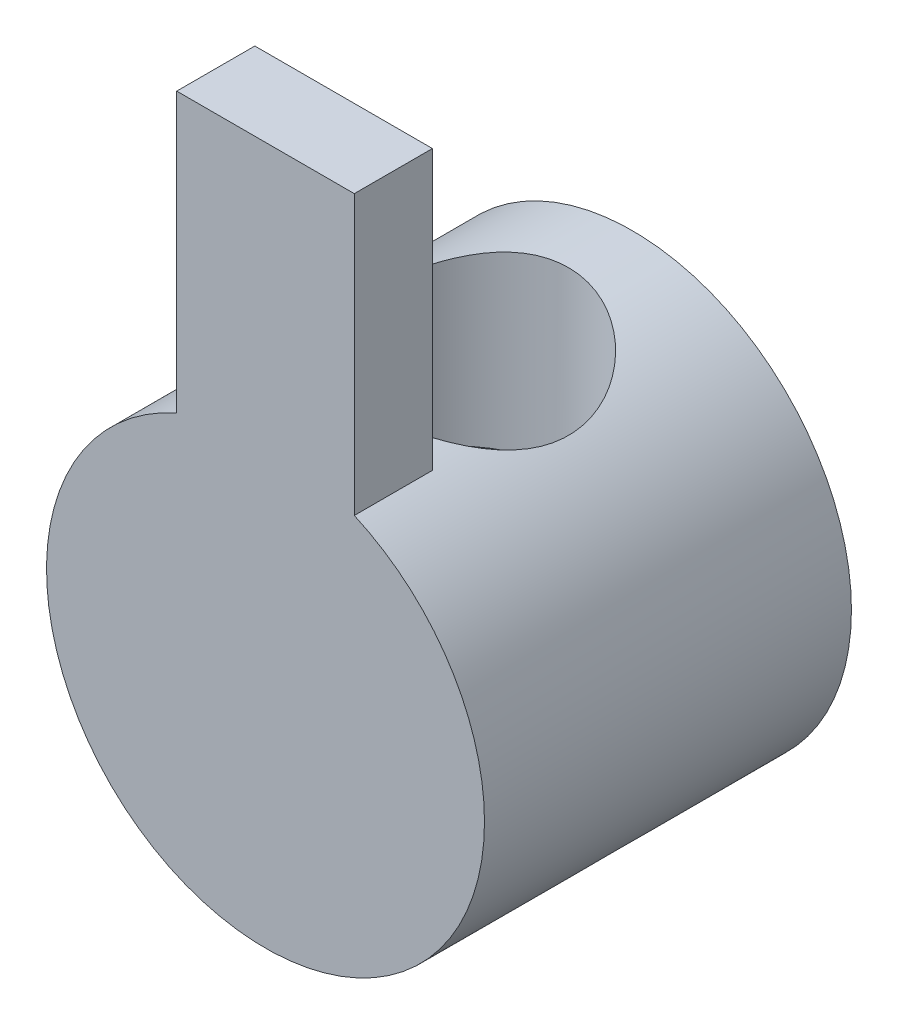
ISO-10303-21;
HEADER;
FILE_DESCRIPTION(('STEP AP214'),'2;1');
FILE_NAME('part.step','',(''),(''),'','','');
FILE_SCHEMA(('AUTOMOTIVE_DESIGN { 1 0 10303 214 1 1 1 1 }'));
ENDSEC;
DATA;
#1=APPLICATION_CONTEXT('core data for automotive mechanical design processes');
#2=APPLICATION_PROTOCOL_DEFINITION('international standard','automotive_design',2000,#1);
#3=PRODUCT_CONTEXT('',#1,'mechanical');
#4=PRODUCT('Part','Part','',(#3));
#5=PRODUCT_RELATED_PRODUCT_CATEGORY('part','',(#4));
#6=PRODUCT_DEFINITION_FORMATION('','',#4);
#7=PRODUCT_DEFINITION_CONTEXT('part definition',#1,'design');
#8=PRODUCT_DEFINITION('design','',#6,#7);
#9=PRODUCT_DEFINITION_SHAPE('','',#8);
#10=(LENGTH_UNIT() NAMED_UNIT(*) SI_UNIT(.MILLI.,.METRE.));
#11=(NAMED_UNIT(*) PLANE_ANGLE_UNIT() SI_UNIT($,.RADIAN.));
#12=(NAMED_UNIT(*) SI_UNIT($,.STERADIAN.) SOLID_ANGLE_UNIT());
#13=UNCERTAINTY_MEASURE_WITH_UNIT(LENGTH_MEASURE(1.E-05),#10,'distance_accuracy_value','');
#14=(GEOMETRIC_REPRESENTATION_CONTEXT(3) GLOBAL_UNCERTAINTY_ASSIGNED_CONTEXT((#13)) GLOBAL_UNIT_ASSIGNED_CONTEXT((#10,
#11,#12)) REPRESENTATION_CONTEXT('',''));
#15=CARTESIAN_POINT('',(0.,0.,0.));
#16=DIRECTION('',(0.,0.,1.));
#17=DIRECTION('',(1.,0.,0.));
#18=AXIS2_PLACEMENT_3D('',#15,#16,#17);
#19=CARTESIAN_POINT('',(0.,-4.98,-12.2));
#20=DIRECTION('',(0.,0.,1.));
#21=DIRECTION('',(1.,0.,0.));
#22=AXIS2_PLACEMENT_3D('',#19,#20,#21);
#23=CYLINDRICAL_SURFACE('',#22,9.25);
#24=CARTESIAN_POINT('',(0.,-4.98,-12.2));
#25=DIRECTION('',(0.,0.,1.));
#26=DIRECTION('',(1.,0.,0.));
#27=AXIS2_PLACEMENT_3D('',#24,#25,#26);
#28=CIRCLE('',#27,9.25);
#29=CARTESIAN_POINT('',(9.25,-4.98,-12.2));
#30=VERTEX_POINT('',#29);
#31=EDGE_CURVE('E110',#30,#30,#28,.T.);
#32=ORIENTED_EDGE('',*,*,#31,.T.);
#33=EDGE_LOOP('',(#32));
#34=FACE_BOUND('',#33,.T.);
#35=CARTESIAN_POINT('',(0.,4.27,0.0999999999999985));
#36=CARTESIAN_POINT('',(0.125647593510289,4.27000003453545,0.10000006483692));
#37=CARTESIAN_POINT('',(0.251295223069269,4.26743424987173,0.0950611530799217));
#38=CARTESIAN_POINT('',(0.501657560367798,4.25723675366162,0.0753652798764421));
#39=CARTESIAN_POINT('',(0.626371891110943,4.24960309606137,0.0606045468637359));
#40=CARTESIAN_POINT('',(0.874030423508736,4.22945308804311,0.0214201803725621));
#41=CARTESIAN_POINT('',(0.996972205637634,4.21693061816722,-0.00301556412363308));
#42=CARTESIAN_POINT('',(1.24009527169886,4.18731532626962,-0.0612718703106895));
#43=CARTESIAN_POINT('',(1.36027540560374,4.17022063640265,-0.0950962676718929));
#44=CARTESIAN_POINT('',(1.59651612061386,4.13196390423794,-0.171591944839765));
#45=CARTESIAN_POINT('',(1.71259262297169,4.11082025745936,-0.21422327882276));
#46=CARTESIAN_POINT('',(1.94052524368646,4.0649104935294,-0.308010680889493));
#47=CARTESIAN_POINT('',(2.05237975113419,4.0401430109269,-0.359169963296731));
#48=CARTESIAN_POINT('',(2.38058299598187,3.96124160631432,-0.524742365438946));
#49=CARTESIAN_POINT('',(2.58981974921282,3.90246674716673,-0.651331338567429));
#50=CARTESIAN_POINT('',(2.99779434854289,3.7735406298297,-0.942336721161118));
#51=CARTESIAN_POINT('',(3.19501430815284,3.70290317594702,-1.1086491310344));
#52=CARTESIAN_POINT('',(3.56018771751853,3.55967635372781,-1.47026255891757));
#53=CARTESIAN_POINT('',(3.72811700631338,3.48708543046828,-1.66558726468876));
#54=CARTESIAN_POINT('',(4.04436204689723,3.34096911089416,-2.09978547111509));
#55=CARTESIAN_POINT('',(4.18979057876551,3.26789036017124,-2.34095084992292));
#56=CARTESIAN_POINT('',(4.3754373970448,3.17002809434751,-2.72123469213695));
#57=CARTESIAN_POINT('',(4.43191696780661,3.13935845484617,-2.85113128433842));
#58=CARTESIAN_POINT('',(4.53345008205538,3.08310716906496,-3.11634869321978));
#59=CARTESIAN_POINT('',(4.57851062262686,3.05752240907603,-3.25166612908045));
#60=CARTESIAN_POINT('',(4.65421319071293,3.01390977990148,-3.51833652563952));
#61=CARTESIAN_POINT('',(4.68556702285432,2.99551616831546,-3.64942787962744));
#62=CARTESIAN_POINT('',(4.7372019929879,2.96495568666964,-3.91442831126504));
#63=CARTESIAN_POINT('',(4.7574892321031,2.95278538586871,-4.0483357939765));
#64=CARTESIAN_POINT('',(4.78667066187734,2.93521170886339,-4.31773387578715));
#65=CARTESIAN_POINT('',(4.79557304226192,2.92980346841714,-4.45322326605506));
#66=CARTESIAN_POINT('',(4.80185470146782,2.92599182363518,-4.72455903769671));
#67=CARTESIAN_POINT('',(4.79923523899117,2.92758765414074,-4.86040537845507));
#68=CARTESIAN_POINT('',(4.78362406547959,2.93703906433421,-5.11328964815069));
#69=CARTESIAN_POINT('',(4.77204331760575,2.94404285522609,-5.23044916627176));
#70=CARTESIAN_POINT('',(4.74039172683203,2.96301671873907,-5.46321985549645));
#71=CARTESIAN_POINT('',(4.72031824715027,2.97498833372376,-5.57883053421348));
#72=CARTESIAN_POINT('',(4.64768333123072,3.01779914509977,-5.92214508888823));
#73=CARTESIAN_POINT('',(4.58269698639744,3.05554122353921,-6.14649410576598));
#74=CARTESIAN_POINT('',(4.42040673659293,3.14596004243372,-6.58579608024956));
#75=CARTESIAN_POINT('',(4.32239472124291,3.19895994744808,-6.80041479603466));
#76=CARTESIAN_POINT('',(4.09737068788395,3.31397392733805,-7.21126065456184));
#77=CARTESIAN_POINT('',(3.97034566902853,3.37599203876846,-7.40747949647443));
#78=CARTESIAN_POINT('',(3.67054337600213,3.5123687784319,-7.80439248294933));
#79=CARTESIAN_POINT('',(3.49387156179465,3.58724941737051,-8.00196838785871));
#80=CARTESIAN_POINT('',(3.10959176480375,3.73407784757194,-8.36612116405168));
#81=CARTESIAN_POINT('',(2.90196686466084,3.80602400744139,-8.53268097086987));
#82=CARTESIAN_POINT('',(2.56457472893086,3.90821397230283,-8.75989149312088));
#83=CARTESIAN_POINT('',(2.44438076900279,3.94209805181129,-8.83339548800244));
#84=CARTESIAN_POINT('',(2.19724463190256,4.00614903343059,-8.96989634665));
#85=CARTESIAN_POINT('',(2.07030534742413,4.0363175108321,-9.03289766723089));
#86=CARTESIAN_POINT('',(1.81055576898893,4.09204662256215,-9.14770123059929));
#87=CARTESIAN_POINT('',(1.67774809896959,4.1176092908424,-9.19950841880345));
#88=CARTESIAN_POINT('',(1.4072135340119,4.16336139950679,-9.29131177111322));
#89=CARTESIAN_POINT('',(1.26948725672706,4.18355151187675,-9.331309412396));
#90=CARTESIAN_POINT('',(1.00243483216978,4.216419028134,-9.39599057693585));
#91=CARTESIAN_POINT('',(0.873418783042717,4.22959682222162,-9.42170285816397));
#92=CARTESIAN_POINT('',(0.613286658966042,4.25056876624534,-9.46247907438193));
#93=CARTESIAN_POINT('',(0.482170790578062,4.25836344243674,-9.47754405025908));
#94=CARTESIAN_POINT('',(0.218986740142389,4.26834470489124,-9.4968164046568));
#95=CARTESIAN_POINT('',(0.086918987285652,4.27053367726438,-9.50102840283379));
#96=CARTESIAN_POINT('',(-0.177083017706328,4.26924660380751,-9.49854817365451));
#97=CARTESIAN_POINT('',(-0.309017276333249,4.26577084814576,-9.49185650482429));
#98=CARTESIAN_POINT('',(-0.560426450047739,4.25379060940739,-9.46869750426051));
#99=CARTESIAN_POINT('',(-0.680005508726133,4.24573962300086,-9.45311128151977));
#100=CARTESIAN_POINT('',(-0.917315816342179,4.22517366383132,-9.41306876042717));
#101=CARTESIAN_POINT('',(-1.03504647209235,4.21265728742216,-9.38860967294739));
#102=CARTESIAN_POINT('',(-1.26782043238782,4.18345352149469,-9.33109010901259));
#103=CARTESIAN_POINT('',(-1.38286455953817,4.16676742753608,-9.29803230410753));
#104=CARTESIAN_POINT('',(-1.60963200596021,4.12960034725995,-9.22364321751274));
#105=CARTESIAN_POINT('',(-1.72135403262167,4.10911790565829,-9.18230876257913));
#106=CARTESIAN_POINT('',(-2.0563601276935,4.04144745876532,-9.04403677818113));
#107=CARTESIAN_POINT('',(-2.27343847170212,3.9888233528393,-8.93433097615687));
#108=CARTESIAN_POINT('',(-2.68666266965281,3.87384190266101,-8.6849997009806));
#109=CARTESIAN_POINT('',(-2.88279992970744,3.81148058806806,-8.54536201442435));
#110=CARTESIAN_POINT('',(-3.2703194172844,3.67528196452711,-8.2234736527187));
#111=CARTESIAN_POINT('',(-3.45909852810095,3.60092523555485,-8.03830538455181));
#112=CARTESIAN_POINT('',(-3.80423678755915,3.45359680230641,-7.6389519826705));
#113=CARTESIAN_POINT('',(-3.96056921993877,3.38062628397623,-7.42474317528393));
#114=CARTESIAN_POINT('',(-4.17183393503002,3.27620911024756,-7.07815016276327));
#115=CARTESIAN_POINT('',(-4.23989370202182,3.24136349647205,-6.95461859555275));
#116=CARTESIAN_POINT('',(-4.36520616796276,3.17551826516319,-6.70123105493787));
#117=CARTESIAN_POINT('',(-4.4224637604015,3.14451690833614,-6.57137797894002));
#118=CARTESIAN_POINT('',(-4.52550104595002,3.08757763852706,-6.30625423767015));
#119=CARTESIAN_POINT('',(-4.571290827889,3.06163527936155,-6.17098845662359));
#120=CARTESIAN_POINT('',(-4.6508267123883,3.01590031923875,-5.89594762761271));
#121=CARTESIAN_POINT('',(-4.68457484566887,2.99610668142551,-5.75617334430778));
#122=CARTESIAN_POINT('',(-4.73679750964838,2.96519203942188,-5.4871768384656));
#123=CARTESIAN_POINT('',(-4.75644153478727,2.95341298756494,-5.35825670645298));
#124=CARTESIAN_POINT('',(-4.78518085513808,2.93611199556758,-5.09883466589774));
#125=CARTESIAN_POINT('',(-4.79427745038942,2.93058928429436,-4.9683329542991));
#126=CARTESIAN_POINT('',(-4.80177429922514,2.92604091365241,-4.70696837424498));
#127=CARTESIAN_POINT('',(-4.80017936437034,2.92701233169882,-4.57610569473889));
#128=CARTESIAN_POINT('',(-4.78633149521628,2.93540245081397,-4.31516103618083));
#129=CARTESIAN_POINT('',(-4.77407913572949,2.94282080416466,-4.18507901540471));
#130=CARTESIAN_POINT('',(-4.74104002041025,2.96262951143206,-3.94106347268444));
#131=CARTESIAN_POINT('',(-4.72134140830928,2.97438253245414,-3.82692883818638));
#132=CARTESIAN_POINT('',(-4.67389688444919,3.00235168196699,-3.60089027959927));
#133=CARTESIAN_POINT('',(-4.64614851649725,3.01856917260797,-3.48898704752457));
#134=CARTESIAN_POINT('',(-4.55124483063466,3.07320153946187,-3.1576408536902));
#135=CARTESIAN_POINT('',(-4.47241055893109,3.11760927506471,-2.94241404266258));
#136=CARTESIAN_POINT('',(-4.28016466378303,3.220932561945,-2.51389895209642));
#137=CARTESIAN_POINT('',(-4.1648107104544,3.28061348587828,-2.30168070432308));
#138=CARTESIAN_POINT('',(-3.90478597211288,3.40665684190463,-1.89816454869099));
#139=CARTESIAN_POINT('',(-3.76009948307426,3.47302284343175,-1.70687793201521));
#140=CARTESIAN_POINT('',(-3.42282388270852,3.61561759756401,-1.32392640577247));
#141=CARTESIAN_POINT('',(-3.22641002109028,3.69197296747677,-1.13566685055634));
#142=CARTESIAN_POINT('',(-2.80277384509563,3.83799391999329,-0.793794898724742));
#143=CARTESIAN_POINT('',(-2.57553332861738,3.907655508313,-0.640203116080667));
#144=CARTESIAN_POINT('',(-2.21355787034268,4.00213063594902,-0.438576359126399));
#145=CARTESIAN_POINT('',(-2.08821815069158,4.0321646936095,-0.375752176086961));
#146=CARTESIAN_POINT('',(-1.83171309548319,4.08777278047773,-0.261021303108918));
#147=CARTESIAN_POINT('',(-1.70055066730806,4.11334900482114,-0.2091092371933));
#148=CARTESIAN_POINT('',(-1.43362377137943,4.15923036926757,-0.116919711081299));
#149=CARTESIAN_POINT('',(-1.2978695978696,4.17954651748231,-0.0766179330024821));
#150=CARTESIAN_POINT('',(-1.02268438525804,4.21433670195568,-0.00807051939576159));
#151=CARTESIAN_POINT('',(-0.883255527248942,4.22881412411881,0.0201821040411733));
#152=CARTESIAN_POINT('',(-0.6200903098667,4.25001119043686,0.0613940376312204));
#153=CARTESIAN_POINT('',(-0.49664794858144,4.25749029089767,0.0758552806084159));
#154=CARTESIAN_POINT('',(-0.248803751523987,4.26748473649665,0.0951583419290708));
#155=CARTESIAN_POINT('',(-0.124401893430716,4.26999996580695,0.0999999358058861));
#156=CARTESIAN_POINT('',(0.,4.27,0.0999999999999985));
#157=B_SPLINE_CURVE_WITH_KNOTS('',3,(#35,#36,#37,#38,#39,#40,#41,#42,#43,#44,#45,#46,#47,#48,
#49,#50,#51,#52,#53,#54,#55,#56,#57,#58,#59,#60,#61,#62,#63,#64,#65,#66,#67,#68,#69,#70,#71,#72,
#73,#74,#75,#76,#77,#78,#79,#80,#81,#82,#83,#84,#85,#86,#87,#88,#89,#90,#91,#92,#93,#94,#95,#96,
#97,#98,#99,#100,#101,#102,#103,#104,#105,#106,#107,#108,#109,#110,#111,#112,#113,#114,#115,
#116,#117,#118,#119,#120,#121,#122,#123,#124,#125,#126,#127,#128,#129,#130,#131,#132,#133,#134,
#135,#136,#137,#138,#139,#140,#141,#142,#143,#144,#145,#146,#147,#148,#149,#150,#151,#152,#153,
#154,#155,#156),.UNSPECIFIED.,.T.,.F.,(4,2,2,2,2,2,2,2,2,2,2,2,2,2,2,2,2,2,2,2,2,2,2,2,2,2,2,2,
2,2,2,2,2,2,2,2,2,2,2,2,2,2,2,2,2,2,2,2,2,2,2,2,2,2,2,2,2,2,2,2,4),(0.,0.376820504596394,
0.753785791331385,1.13122445640715,1.50881754902236,1.88473417515956,2.26079281214504,
3.01212531742031,3.81131948724642,4.61116980148079,5.47911993989157,5.91338226316208,
6.3473778424374,6.75490233766244,7.16220193291917,7.56920837111969,7.97617034706671,
8.32955368771623,8.68304682570704,9.38954990560178,10.1122829070192,10.8353404056703,
11.6581658632418,12.4814426947265,12.9156692956255,13.3497111606068,13.7835608778986,
14.2173563048213,14.6134545095847,15.0095139861782,15.4054048490295,15.8012754335284,
16.1634306308816,16.5256997681773,16.8878564856283,17.2501523197055,17.9933655208254,
18.7368825618637,19.5575157469922,20.3788219756442,20.8141728569251,21.2493260439771,
21.6840950486283,22.1187906985421,22.5110466668871,22.9032542819882,23.2952854018595,
23.6872953786865,24.0361456339777,24.3851024448424,25.0825732723424,25.8261818772951,
26.570189651098,27.4142054490335,28.2587217968685,28.6883732800283,29.1178125918709,
29.5463457874399,29.9746301160364,30.3477060273477,30.720790643978),.UNSPECIFIED.);
#158=CARTESIAN_POINT('',(0.974679434480888,4.21850531336478,0.));
#159=VERTEX_POINT('',#158);
#160=CARTESIAN_POINT('',(-0.974679434480891,4.21850531336478,0.));
#161=VERTEX_POINT('',#160);
#162=EDGE_CURVE('E46',#159,#161,#157,.T.);
#163=ORIENTED_EDGE('',*,*,#162,.F.);
#164=CARTESIAN_POINT('',(0.,-4.98,0.));
#165=DIRECTION('',(0.,0.,-1.));
#166=DIRECTION('',(-1.,0.,0.));
#167=AXIS2_PLACEMENT_3D('',#164,#165,#166);
#168=CIRCLE('',#167,9.25);
#169=CARTESIAN_POINT('',(3.75,3.47576726264388,0.));
#170=VERTEX_POINT('',#169);
#171=EDGE_CURVE('E74',#159,#170,#168,.T.);
#172=ORIENTED_EDGE('',*,*,#171,.T.);
#173=DIRECTION('',(0.,0.,1.));
#174=VECTOR('',#173,1.);
#175=CARTESIAN_POINT('',(3.75,3.47576726264388,-12.2));
#176=LINE('',#175,#174);
#177=CARTESIAN_POINT('',(3.75,3.47576726264388,3.3));
#178=VERTEX_POINT('',#177);
#179=EDGE_CURVE('E120',#178,#170,#176,.F.);
#180=ORIENTED_EDGE('',*,*,#179,.F.);
#181=CARTESIAN_POINT('',(0.,-4.98,3.3));
#182=DIRECTION('',(0.,0.,1.));
#183=DIRECTION('',(1.,0.,0.));
#184=AXIS2_PLACEMENT_3D('',#181,#182,#183);
#185=CIRCLE('',#184,9.25);
#186=CARTESIAN_POINT('',(-3.75,3.47576726264388,3.3));
#187=VERTEX_POINT('',#186);
#188=EDGE_CURVE('E114',#187,#178,#185,.T.);
#189=ORIENTED_EDGE('',*,*,#188,.F.);
#190=DIRECTION('',(0.,0.,1.));
#191=VECTOR('',#190,1.);
#192=CARTESIAN_POINT('',(-3.75,3.47576726264388,-12.2));
#193=LINE('',#192,#191);
#194=CARTESIAN_POINT('',(-3.75,3.47576726264388,0.));
#195=VERTEX_POINT('',#194);
#196=EDGE_CURVE('E113',#195,#187,#193,.T.);
#197=ORIENTED_EDGE('',*,*,#196,.F.);
#198=EDGE_CURVE('E93',#195,#161,#168,.T.);
#199=ORIENTED_EDGE('',*,*,#198,.T.);
#200=EDGE_LOOP('',(#163,#172,#180,#189,#197,#199));
#201=FACE_BOUND('',#200,.T.);
#202=CARTESIAN_POINT('',(0.,-14.23,-11.45));
#203=CARTESIAN_POINT('',(-0.165943842324624,-14.2299984314563,-11.4499983670699));
#204=CARTESIAN_POINT('',(-0.331931036637358,-14.2255234577108,-11.4438695176112));
#205=CARTESIAN_POINT('',(-0.662603075682822,-14.2077248199837,-11.4194473815296));
#206=CARTESIAN_POINT('',(-0.82728707225347,-14.1943958072115,-11.4011467418297));
#207=CARTESIAN_POINT('',(-1.15428694814472,-14.1591727559551,-11.3526304200706));
#208=CARTESIAN_POINT('',(-1.31659765377472,-14.1372622655558,-11.3223918504036));
#209=CARTESIAN_POINT('',(-1.63740397922717,-14.0853737535338,-11.2504542492284));
#210=CARTESIAN_POINT('',(-1.79589787041886,-14.0553921486864,-11.2087501273372));
#211=CARTESIAN_POINT('',(-2.1069862235786,-13.9882329549245,-11.114774814081));
#212=CARTESIAN_POINT('',(-2.25961213236588,-13.9511030062595,-11.0625734843246));
#213=CARTESIAN_POINT('',(-2.55925691317514,-13.8702659545305,-10.948076821919));
#214=CARTESIAN_POINT('',(-2.7062735460835,-13.8265562586885,-10.8857775093696));
#215=CARTESIAN_POINT('',(-3.13764864937317,-13.6868241050211,-10.6848240732834));
#216=CARTESIAN_POINT('',(-3.41274125536738,-13.5821070339948,-10.5319886618845));
#217=CARTESIAN_POINT('',(-3.95809255101226,-13.3461431866071,-10.1782568641753));
#218=CARTESIAN_POINT('',(-4.22562655573142,-13.2133484517905,-9.97425007147972));
#219=CARTESIAN_POINT('',(-4.725166271963,-12.9371829655524,-9.53185244390425));
#220=CARTESIAN_POINT('',(-4.95711491718703,-12.7937957619095,-9.29340754692987));
#221=CARTESIAN_POINT('',(-5.29730250994122,-12.564501593273,-8.88809739564832));
#222=CARTESIAN_POINT('',(-5.41769866612545,-12.4787424838441,-8.73116307724046));
#223=CARTESIAN_POINT('',(-5.64479848480098,-12.3093105501197,-8.40648235219788));
#224=CARTESIAN_POINT('',(-5.75149822963032,-12.225638328238,-8.23873287256225));
#225=CARTESIAN_POINT('',(-5.95043955834905,-12.0631666468608,-7.8928829886027));
#226=CARTESIAN_POINT('',(-6.04269751467093,-11.984361731672,-7.71479462408451));
#227=CARTESIAN_POINT('',(-6.21198208401077,-11.8346724318916,-7.34849310391611));
#228=CARTESIAN_POINT('',(-6.28901717975803,-11.7637836457787,-7.16028566178801));
#229=CARTESIAN_POINT('',(-6.44999727803563,-11.6114523303844,-6.70873863213247));
#230=CARTESIAN_POINT('',(-6.52753182855456,-11.5344959297393,-6.4414428922764));
#231=CARTESIAN_POINT('',(-6.61910070341962,-11.4415698501378,-6.03031747951745));
#232=CARTESIAN_POINT('',(-6.64549404115158,-11.4143543984324,-5.89165503434519));
#233=CARTESIAN_POINT('',(-6.68965942524204,-11.3684254110125,-5.61160007633456));
#234=CARTESIAN_POINT('',(-6.70743577168125,-11.349707635055,-5.47020896187172));
#235=CARTESIAN_POINT('',(-6.73412721392766,-11.321483677924,-5.18453635617327));
#236=CARTESIAN_POINT('',(-6.74297135728832,-11.3120512692444,-5.04024086677406));
#237=CARTESIAN_POINT('',(-6.75135612671584,-11.303110751872,-4.75107199369832));
#238=CARTESIAN_POINT('',(-6.75089710422595,-11.3036022682856,-4.60619863205863));
#239=CARTESIAN_POINT('',(-6.74068275636643,-11.3144889331242,-4.31706991815049));
#240=CARTESIAN_POINT('',(-6.73092170234227,-11.3248901844568,-4.1728150017465));
#241=CARTESIAN_POINT('',(-6.70231256132241,-11.3551026311003,-3.88620877942199));
#242=CARTESIAN_POINT('',(-6.6834634599778,-11.3749148768016,-3.74385768781724));
#243=CARTESIAN_POINT('',(-6.63444277233403,-11.4257777567057,-3.44624860843295));
#244=CARTESIAN_POINT('',(-6.6032380242657,-11.4578399893373,-3.2913346826085));
#245=CARTESIAN_POINT('',(-6.53065388359858,-11.5310081316014,-2.98602486692926));
#246=CARTESIAN_POINT('',(-6.48926767025175,-11.5721201018662,-2.83563208197517));
#247=CARTESIAN_POINT('',(-6.39688626851069,-11.6618030808157,-2.53981368651825));
#248=CARTESIAN_POINT('',(-6.34587342144995,-11.7103877663351,-2.39439779385698));
#249=CARTESIAN_POINT('',(-6.2348862151409,-11.8133317445756,-2.10922732613575));
#250=CARTESIAN_POINT('',(-6.17491431543103,-11.8676894512427,-1.96947121063413));
#251=CARTESIAN_POINT('',(-6.0244830471468,-12.00006204684,-1.64888678327621));
#252=CARTESIAN_POINT('',(-5.9306132845945,-12.0798075292012,-1.47036735635117));
#253=CARTESIAN_POINT('',(-5.72840696800981,-12.2439401282371,-1.12395510494318));
#254=CARTESIAN_POINT('',(-5.62006583815833,-12.3283287080666,-0.956065666495023));
#255=CARTESIAN_POINT('',(-5.38940231969706,-12.4991394994581,-0.631021246578719));
#256=CARTESIAN_POINT('',(-5.26706722574048,-12.5855635015773,-0.473876230264248));
#257=CARTESIAN_POINT('',(-5.0089110063555,-12.7580079750317,-0.170881261674169));
#258=CARTESIAN_POINT('',(-4.87309138980756,-12.8440284903903,-0.0250300488970285));
#259=CARTESIAN_POINT('',(-4.58637838392326,-13.0146644262326,0.256667422004795));
#260=CARTESIAN_POINT('',(-4.43530898463894,-13.099246086342,0.392355354575293));
#261=CARTESIAN_POINT('',(-4.1199691640285,-13.2637175422154,0.650690934583875));
#262=CARTESIAN_POINT('',(-3.95569735183776,-13.3436068421041,0.773337204922181));
#263=CARTESIAN_POINT('',(-3.61480479862082,-13.4964849034245,1.00420713075458));
#264=CARTESIAN_POINT('',(-3.43820870362142,-13.5694867871818,1.11245838061257));
#265=CARTESIAN_POINT('',(-3.07319185527257,-13.7067386326245,1.31343113306558));
#266=CARTESIAN_POINT('',(-2.88477558389494,-13.7709918826643,1.40615847366703));
#267=CARTESIAN_POINT('',(-2.54697747447707,-13.8737115639935,1.55300733496548));
#268=CARTESIAN_POINT('',(-2.39996354061209,-13.9145669492155,1.61093300658345));
#269=CARTESIAN_POINT('',(-2.10072677566551,-13.9896183675947,1.71674497028525));
#270=CARTESIAN_POINT('',(-1.9485050992189,-14.0238158657991,1.76463347119525));
#271=CARTESIAN_POINT('',(-1.6397505141567,-14.0848596140033,1.84975939466391));
#272=CARTESIAN_POINT('',(-1.48321990018314,-14.1117096964563,1.88700237044168));
#273=CARTESIAN_POINT('',(-1.16676945142921,-14.157510834091,1.95035221558551));
#274=CARTESIAN_POINT('',(-1.00684952820876,-14.176461682884,1.97645879398376));
#275=CARTESIAN_POINT('',(-0.684167636022157,-14.2060913787456,2.01721364172196));
#276=CARTESIAN_POINT('',(-0.521397176671289,-14.21673851931,2.03181799355064));
#277=CARTESIAN_POINT('',(-0.194887849161081,-14.2293896789304,2.049166234679));
#278=CARTESIAN_POINT('',(-0.0311489826012318,-14.2313937122582,2.05191014356276));
#279=CARTESIAN_POINT('',(0.295974168065768,-14.2267107209532,2.04549211100486));
#280=CARTESIAN_POINT('',(0.459358440364227,-14.2200234111987,2.03632977897571));
#281=CARTESIAN_POINT('',(0.784456113704597,-14.1981164017709,2.00624904188758));
#282=CARTESIAN_POINT('',(0.9461695608329,-14.1828969380835,1.98533096197389));
#283=CARTESIAN_POINT('',(1.2573437431878,-14.145407744051,1.93362613827636));
#284=CARTESIAN_POINT('',(1.40696889590538,-14.1236011332407,1.90348633751711));
#285=CARTESIAN_POINT('',(1.70279271529885,-14.073157973752,1.83346090018125));
#286=CARTESIAN_POINT('',(1.84899019858216,-14.044519103309,1.79357195049835));
#287=CARTESIAN_POINT('',(2.13708848373636,-13.9809500780904,1.70453553642348));
#288=CARTESIAN_POINT('',(2.27899036155028,-13.9460215142156,1.65539041312303));
#289=CARTESIAN_POINT('',(2.55791638341449,-13.8704712311659,1.54835241032251));
#290=CARTESIAN_POINT('',(2.69493871192259,-13.8298474201394,1.49045631599687));
#291=CARTESIAN_POINT('',(3.11974846638232,-13.6933559175425,1.29432393747198));
#292=CARTESIAN_POINT('',(3.39770938568646,-13.5881473547218,1.14090684449312));
#293=CARTESIAN_POINT('',(3.92475733002631,-13.3610104066766,0.800675121743934));
#294=CARTESIAN_POINT('',(4.17382548388003,-13.2390712061228,0.613838864618013));
#295=CARTESIAN_POINT('',(4.54580366322969,-13.0374781085033,0.293145893986789));
#296=CARTESIAN_POINT('',(4.67872308188028,-12.960871958903,0.168777930795844));
#297=CARTESIAN_POINT('',(4.9335990264521,-12.8058754513925,-0.0896817878223276));
#298=CARTESIAN_POINT('',(5.05555747000325,-12.7274854085948,-0.223771834919018));
#299=CARTESIAN_POINT('',(5.28838370497044,-12.5704701591118,-0.501386321277439));
#300=CARTESIAN_POINT('',(5.39924025734965,-12.4918447954704,-0.644920082210804));
#301=CARTESIAN_POINT('',(5.60941580415822,-12.3362247404239,-0.941022602865277));
#302=CARTESIAN_POINT('',(5.70873629429033,-12.2592298386828,-1.09359018742887));
#303=CARTESIAN_POINT('',(5.88488212643867,-12.1173645373759,-1.38987623202969));
#304=CARTESIAN_POINT('',(5.96298118224052,-12.0521061121938,-1.53265188411565));
#305=CARTESIAN_POINT('',(6.1093470995623,-11.9260567438969,-1.82508944411257));
#306=CARTESIAN_POINT('',(6.17761362149336,-11.8652659551175,-1.97475158962877));
#307=CARTESIAN_POINT('',(6.30364088246429,-11.7500731478931,-2.28051458994658));
#308=CARTESIAN_POINT('',(6.36141866870443,-11.6956608145695,-2.43660448183999));
#309=CARTESIAN_POINT('',(6.46588310920273,-11.5951429532326,-2.755031332617));
#310=CARTESIAN_POINT('',(6.51257429058517,-11.5490340364517,-2.91736571004122));
#311=CARTESIAN_POINT('',(6.58506605556351,-11.476262724408,-3.21105558453869));
#312=CARTESIAN_POINT('',(6.61320301310475,-11.4475546381504,-3.34132951143613));
#313=CARTESIAN_POINT('',(6.66187130556003,-11.3974134191487,-3.60461224779528));
#314=CARTESIAN_POINT('',(6.68240706765532,-11.3759760523142,-3.73761941752519));
#315=CARTESIAN_POINT('',(6.7155353205381,-11.3411842804359,-4.005534244397));
#316=CARTESIAN_POINT('',(6.72813612203323,-11.327821419127,-4.14043976134191));
#317=CARTESIAN_POINT('',(6.74519078107874,-11.3096965624874,-4.41134908457843));
#318=CARTESIAN_POINT('',(6.74964460207405,-11.3049346057486,-4.54735289579526));
#319=CARTESIAN_POINT('',(6.7503150681832,-11.3042190774909,-4.81964771562554));
#320=CARTESIAN_POINT('',(6.74651697666804,-11.3082812645146,-4.95593880308837));
#321=CARTESIAN_POINT('',(6.73073139560532,-11.32506779267,-5.22749997057492));
#322=CARTESIAN_POINT('',(6.71874393883744,-11.3377920991298,-5.36277005468323));
#323=CARTESIAN_POINT('',(6.68679029214961,-11.3713903050205,-5.63148588793479));
#324=CARTESIAN_POINT('',(6.66681507735199,-11.3922734219752,-5.764929396365));
#325=CARTESIAN_POINT('',(6.61921140682057,-11.4414012774202,-6.02912579886485));
#326=CARTESIAN_POINT('',(6.59157843071815,-11.4696503634508,-6.15987705457415));
#327=CARTESIAN_POINT('',(6.51974691164479,-11.5419135694649,-6.45644139602613));
#328=CARTESIAN_POINT('',(6.47306583106446,-11.5881177856863,-6.62112210304594));
#329=CARTESIAN_POINT('',(6.36830603265448,-11.6891330062217,-6.94411122548286));
#330=CARTESIAN_POINT('',(6.31022231293282,-11.7439477855367,-7.10241680752269));
#331=CARTESIAN_POINT('',(6.18332617437792,-11.8601442032425,-7.41238976137246));
#332=CARTESIAN_POINT('',(6.11450070425036,-11.9215338012272,-7.56404876660516));
#333=CARTESIAN_POINT('',(5.96676997400219,-12.048922965175,-7.86031002074113));
#334=CARTESIAN_POINT('',(5.88786538160381,-12.1149222256258,-8.00491273623366));
#335=CARTESIAN_POINT('',(5.71793261033992,-12.2518630659985,-8.29113511820704));
#336=CARTESIAN_POINT('',(5.62661550765078,-12.3228930007289,-8.43254102940832));
#337=CARTESIAN_POINT('',(5.43410208975612,-12.4664875075197,-8.70764800202723));
#338=CARTESIAN_POINT('',(5.33290245594024,-12.5390525886387,-8.84134645110022));
#339=CARTESIAN_POINT('',(5.01477218030985,-12.7569161650448,-9.23065958924485));
#340=CARTESIAN_POINT('',(4.7832507662932,-12.9024326160635,-9.4745917913083));
#341=CARTESIAN_POINT('',(4.38010410965024,-13.1291265674496,-9.84003909921335));
#342=CARTESIAN_POINT('',(4.21989192363294,-13.2134424974457,-9.97244163440415));
#343=CARTESIAN_POINT('',(3.8858958698412,-13.376235918698,-10.2232150958033));
#344=CARTESIAN_POINT('',(3.71210889886523,-13.4547120669245,-10.3415827979794));
#345=CARTESIAN_POINT('',(3.35187752285069,-13.6035362595298,-10.5627683728797));
#346=CARTESIAN_POINT('',(3.1654457023978,-13.6738922022997,-10.665601386542));
#347=CARTESIAN_POINT('',(2.7808360664261,-13.8044334364598,-10.8542885956928));
#348=CARTESIAN_POINT('',(2.582664407752,-13.8646239963095,-10.9401515902638));
#349=CARTESIAN_POINT('',(2.23400278108559,-13.9574385200638,-11.0714907620715));
#350=CARTESIAN_POINT('',(2.08599472681241,-13.9930325924427,-11.1215062669759));
#351=CARTESIAN_POINT('',(1.78549967590825,-14.0573386336922,-11.2114566997161));
#352=CARTESIAN_POINT('',(1.63301375018656,-14.0860522332617,-11.2513940162413));
#353=CARTESIAN_POINT('',(1.32484008643997,-14.1359602737769,-11.3205876423352));
#354=CARTESIAN_POINT('',(1.16916133712487,-14.1571733910806,-11.3498704871239));
#355=CARTESIAN_POINT('',(0.855328534132541,-14.1917211049006,-11.3974678536143));
#356=CARTESIAN_POINT('',(0.697175813919248,-14.2050598050529,-11.4157880883857));
#357=CARTESIAN_POINT('',(0.448933808299978,-14.2195344654995,-11.4356527574781));
#358=CARTESIAN_POINT('',(0.359290090353607,-14.2234556436238,-11.4410294776888));
#359=CARTESIAN_POINT('',(0.179768513844679,-14.2286890622194,-11.4482038519616));
#360=CARTESIAN_POINT('',(0.0898906173375264,-14.2300008496691,-11.4500008845468));
#361=CARTESIAN_POINT('',(0.,-14.23,-11.45));
#362=B_SPLINE_CURVE_WITH_KNOTS('',3,(#202,#203,#204,#205,#206,#207,#208,#209,#210,#211,#212,
#213,#214,#215,#216,#217,#218,#219,#220,#221,#222,#223,#224,#225,#226,#227,#228,#229,#230,#231,
#232,#233,#234,#235,#236,#237,#238,#239,#240,#241,#242,#243,#244,#245,#246,#247,#248,#249,#250,
#251,#252,#253,#254,#255,#256,#257,#258,#259,#260,#261,#262,#263,#264,#265,#266,#267,#268,#269,
#270,#271,#272,#273,#274,#275,#276,#277,#278,#279,#280,#281,#282,#283,#284,#285,#286,#287,#288,
#289,#290,#291,#292,#293,#294,#295,#296,#297,#298,#299,#300,#301,#302,#303,#304,#305,#306,#307,
#308,#309,#310,#311,#312,#313,#314,#315,#316,#317,#318,#319,#320,#321,#322,#323,#324,#325,#326,
#327,#328,#329,#330,#331,#332,#333,#334,#335,#336,#337,#338,#339,#340,#341,#342,#343,#344,#345,
#346,#347,#348,#349,#350,#351,#352,#353,#354,#355,#356,#357,#358,#359,#360,#361),.UNSPECIFIED.,
.T.,.F.,(4,2,2,2,2,2,2,2,2,2,2,2,2,2,2,2,2,2,2,2,2,2,2,2,2,2,2,2,2,2,2,2,2,2,2,2,2,2,2,2,2,2,2,
2,2,2,2,2,2,2,2,2,2,2,2,2,2,2,2,2,2,2,2,2,2,2,2,2,2,2,2,2,2,2,2,2,2,2,2,4),(0.,
0.497734817817617,0.99577059470922,1.49476588797357,1.99398307988826,2.48998171384456,
2.98617631234774,3.9772673612611,5.05866959472848,6.1417882835893,6.78794413490498,
7.43428439992747,8.07988652769477,8.72512788177349,9.58767635428414,10.0184933115666,
10.4490950591971,10.8830909839524,11.3170705137892,11.7513174826802,12.1856129306267,
12.668640447446,13.1519924385547,13.6362398426839,14.1203545493277,14.7701176245814,
15.4200866422154,16.0706505324474,16.7211417082657,17.3802591091644,18.039446038852,
18.697350549712,19.3550070868999,19.8441585734673,20.3332023018128,20.8219904538569,
21.3107913760015,21.8014496979498,22.2921072097173,22.7827808180447,23.2734408557883,
23.7354754151756,24.1976672091368,24.6597422611463,25.1219874791273,26.1213670793508,
27.1213957878981,27.7133836984762,28.3052678379423,28.8977452414755,29.4901457416762,
30.0157294045517,30.5413312153008,31.0660709712974,31.5905960841957,31.9992097746023,
32.4075850993372,32.8155319962996,33.2234807236939,33.6321585826466,34.0408348057878,
34.4499740776524,34.8593553803527,35.3904410601645,35.9217602291706,36.4537300533554,
36.985664653834,37.5332873896705,38.0810946568839,39.1763334511268,39.8484673063914,
40.5207552639536,41.1923836864935,41.8636629457246,42.3438880734363,42.8239992730995,
43.3029064242814,43.7815637792726,44.051136447627,44.3207559129668),.UNSPECIFIED.);
#363=CARTESIAN_POINT('',(0.,-14.23,-11.45));
#364=VERTEX_POINT('',#363);
#365=EDGE_CURVE('E117',#364,#364,#362,.T.);
#366=ORIENTED_EDGE('',*,*,#365,.T.);
#367=EDGE_LOOP('',(#366));
#368=FACE_BOUND('',#367,.T.);
#369=ADVANCED_FACE('F33',(#34,#201,#368),#23,.T.);
#370=CARTESIAN_POINT('',(3.75,-15.25,3.3));
#371=DIRECTION('',(-1.,0.,0.));
#372=DIRECTION('',(0.,0.,1.));
#373=AXIS2_PLACEMENT_3D('',#370,#371,#372);
#374=PLANE('',#373);
#375=DIRECTION('',(0.,1.,0.));
#376=VECTOR('',#375,1.);
#377=CARTESIAN_POINT('',(3.75,-15.25,3.3));
#378=LINE('',#377,#376);
#379=CARTESIAN_POINT('',(3.75,15.25,3.3));
#380=VERTEX_POINT('',#379);
#381=EDGE_CURVE('E122',#178,#380,#378,.T.);
#382=ORIENTED_EDGE('',*,*,#381,.F.);
#383=ORIENTED_EDGE('',*,*,#179,.T.);
#384=DIRECTION('',(0.,1.,0.));
#385=VECTOR('',#384,1.);
#386=CARTESIAN_POINT('',(3.75,-15.25,0.));
#387=LINE('',#386,#385);
#388=CARTESIAN_POINT('',(3.75,15.25,0.));
#389=VERTEX_POINT('',#388);
#390=EDGE_CURVE('E65',#170,#389,#387,.T.);
#391=ORIENTED_EDGE('',*,*,#390,.T.);
#392=DIRECTION('',(0.,0.,-1.));
#393=VECTOR('',#392,1.);
#394=CARTESIAN_POINT('',(3.75,15.25,3.3));
#395=LINE('',#394,#393);
#396=EDGE_CURVE('E94',#380,#389,#395,.T.);
#397=ORIENTED_EDGE('',*,*,#396,.F.);
#398=EDGE_LOOP('',(#382,#383,#391,#397));
#399=FACE_BOUND('',#398,.T.);
#400=ADVANCED_FACE('F35',(#399),#374,.F.);
#401=CARTESIAN_POINT('',(-3.75,15.25,3.3));
#402=DIRECTION('',(0.,-1.,0.));
#403=DIRECTION('',(0.,0.,-1.));
#404=AXIS2_PLACEMENT_3D('',#401,#402,#403);
#405=PLANE('',#404);
#406=DIRECTION('',(-1.,0.,0.));
#407=VECTOR('',#406,1.);
#408=CARTESIAN_POINT('',(-3.75,15.25,0.));
#409=LINE('',#408,#407);
#410=CARTESIAN_POINT('',(-3.75,15.25,0.));
#411=VERTEX_POINT('',#410);
#412=EDGE_CURVE('E130',#389,#411,#409,.T.);
#413=ORIENTED_EDGE('',*,*,#412,.T.);
#414=DIRECTION('',(0.,0.,-1.));
#415=VECTOR('',#414,1.);
#416=CARTESIAN_POINT('',(-3.75,15.25,3.3));
#417=LINE('',#416,#415);
#418=CARTESIAN_POINT('',(-3.75,15.25,3.3));
#419=VERTEX_POINT('',#418);
#420=EDGE_CURVE('E128',#419,#411,#417,.T.);
#421=ORIENTED_EDGE('',*,*,#420,.F.);
#422=DIRECTION('',(-1.,0.,0.));
#423=VECTOR('',#422,1.);
#424=CARTESIAN_POINT('',(-3.75,15.25,3.3));
#425=LINE('',#424,#423);
#426=EDGE_CURVE('E54',#380,#419,#425,.T.);
#427=ORIENTED_EDGE('',*,*,#426,.F.);
#428=ORIENTED_EDGE('',*,*,#396,.T.);
#429=EDGE_LOOP('',(#413,#421,#427,#428));
#430=FACE_BOUND('',#429,.T.);
#431=ADVANCED_FACE('F167',(#430),#405,.F.);
#432=CARTESIAN_POINT('',(-3.75,-15.25,3.3));
#433=DIRECTION('',(1.,0.,0.));
#434=DIRECTION('',(0.,0.,-1.));
#435=AXIS2_PLACEMENT_3D('',#432,#433,#434);
#436=PLANE('',#435);
#437=DIRECTION('',(0.,-1.,0.));
#438=VECTOR('',#437,1.);
#439=CARTESIAN_POINT('',(-3.75,-15.25,0.));
#440=LINE('',#439,#438);
#441=EDGE_CURVE('E124',#411,#195,#440,.T.);
#442=ORIENTED_EDGE('',*,*,#441,.T.);
#443=ORIENTED_EDGE('',*,*,#196,.T.);
#444=DIRECTION('',(0.,-1.,0.));
#445=VECTOR('',#444,1.);
#446=CARTESIAN_POINT('',(-3.75,-15.25,3.3));
#447=LINE('',#446,#445);
#448=EDGE_CURVE('E126',#419,#187,#447,.T.);
#449=ORIENTED_EDGE('',*,*,#448,.F.);
#450=ORIENTED_EDGE('',*,*,#420,.T.);
#451=EDGE_LOOP('',(#442,#443,#449,#450));
#452=FACE_BOUND('',#451,.T.);
#453=ADVANCED_FACE('F171',(#452),#436,.F.);
#454=CARTESIAN_POINT('',(3.75,15.25,3.3));
#455=DIRECTION('',(0.,0.,-1.));
#456=DIRECTION('',(-1.,0.,0.));
#457=AXIS2_PLACEMENT_3D('',#454,#455,#456);
#458=PLANE('',#457);
#459=ORIENTED_EDGE('',*,*,#188,.T.);
#460=ORIENTED_EDGE('',*,*,#381,.T.);
#461=ORIENTED_EDGE('',*,*,#426,.T.);
#462=ORIENTED_EDGE('',*,*,#448,.T.);
#463=EDGE_LOOP('',(#459,#460,#461,#462));
#464=FACE_BOUND('',#463,.T.);
#465=ADVANCED_FACE('F159',(#464),#458,.F.);
#466=CARTESIAN_POINT('',(3.75,15.25,0.));
#467=DIRECTION('',(0.,0.,-1.));
#468=DIRECTION('',(-1.,0.,0.));
#469=AXIS2_PLACEMENT_3D('',#466,#467,#468);
#470=PLANE('',#469);
#471=ORIENTED_EDGE('',*,*,#171,.F.);
#472=CARTESIAN_POINT('',(0.,-4.98,0.));
#473=DIRECTION('',(0.,0.,1.));
#474=DIRECTION('',(-1.,0.,0.));
#475=AXIS2_PLACEMENT_3D('',#472,#473,#474);
#476=CIRCLE('',#475,9.25);
#477=EDGE_CURVE('E92',#159,#161,#476,.T.);
#478=ORIENTED_EDGE('',*,*,#477,.T.);
#479=ORIENTED_EDGE('',*,*,#198,.F.);
#480=ORIENTED_EDGE('',*,*,#441,.F.);
#481=ORIENTED_EDGE('',*,*,#412,.F.);
#482=ORIENTED_EDGE('',*,*,#390,.F.);
#483=EDGE_LOOP('',(#471,#478,#479,#480,#481,#482));
#484=FACE_BOUND('',#483,.T.);
#485=ADVANCED_FACE('F89',(#484),#470,.T.);
#486=CARTESIAN_POINT('',(0.,-4.98,-12.2));
#487=DIRECTION('',(0.,0.,1.));
#488=DIRECTION('',(1.,0.,0.));
#489=AXIS2_PLACEMENT_3D('',#486,#487,#488);
#490=PLANE('',#489);
#491=ORIENTED_EDGE('',*,*,#31,.F.);
#492=EDGE_LOOP('',(#491));
#493=FACE_BOUND('',#492,.T.);
#494=ADVANCED_FACE('F148',(#493),#490,.F.);
#495=CARTESIAN_POINT('',(0.,-14.23,-4.7));
#496=DIRECTION('',(0.,1.,0.));
#497=DIRECTION('',(0.,0.,1.));
#498=AXIS2_PLACEMENT_3D('',#495,#496,#497);
#499=CYLINDRICAL_SURFACE('',#498,4.8);
#500=CARTESIAN_POINT('',(0.,-3.25,-4.7));
#501=DIRECTION('',(0.,1.,0.));
#502=DIRECTION('',(0.,0.,1.));
#503=AXIS2_PLACEMENT_3D('',#500,#501,#502);
#504=CIRCLE('',#503,4.8);
#505=CARTESIAN_POINT('',(0.,-3.25,0.0999999999999985));
#506=VERTEX_POINT('',#505);
#507=EDGE_CURVE('E107',#506,#506,#504,.F.);
#508=ORIENTED_EDGE('',*,*,#507,.T.);
#509=EDGE_LOOP('',(#508));
#510=FACE_BOUND('',#509,.T.);
#511=ORIENTED_EDGE('',*,*,#162,.T.);
#512=CARTESIAN_POINT('',(0.,4.27,0.0999999999999985));
#513=CARTESIAN_POINT('',(0.125647593510289,4.27000003453545,0.10000006483692));
#514=CARTESIAN_POINT('',(0.251295223069269,4.26743424987173,0.0950611530799217));
#515=CARTESIAN_POINT('',(0.501657560367798,4.25723675366162,0.0753652798764421));
#516=CARTESIAN_POINT('',(0.626371891110943,4.24960309606137,0.0606045468637359));
#517=CARTESIAN_POINT('',(0.874030423508736,4.22945308804311,0.0214201803725621));
#518=CARTESIAN_POINT('',(0.996972205637634,4.21693061816722,-0.00301556412363308));
#519=CARTESIAN_POINT('',(1.24009527169886,4.18731532626962,-0.0612718703106895));
#520=CARTESIAN_POINT('',(1.36027540560374,4.17022063640265,-0.0950962676718929));
#521=CARTESIAN_POINT('',(1.59651612061386,4.13196390423794,-0.171591944839765));
#522=CARTESIAN_POINT('',(1.71259262297169,4.11082025745936,-0.21422327882276));
#523=CARTESIAN_POINT('',(1.94052524368646,4.0649104935294,-0.308010680889493));
#524=CARTESIAN_POINT('',(2.05237975113419,4.0401430109269,-0.359169963296731));
#525=CARTESIAN_POINT('',(2.38058299598187,3.96124160631432,-0.524742365438946));
#526=CARTESIAN_POINT('',(2.58981974921282,3.90246674716673,-0.651331338567429));
#527=CARTESIAN_POINT('',(2.99779434854289,3.7735406298297,-0.942336721161118));
#528=CARTESIAN_POINT('',(3.19501430815284,3.70290317594702,-1.1086491310344));
#529=CARTESIAN_POINT('',(3.56018771751853,3.55967635372781,-1.47026255891757));
#530=CARTESIAN_POINT('',(3.72811700631338,3.48708543046828,-1.66558726468876));
#531=CARTESIAN_POINT('',(4.04436204689723,3.34096911089416,-2.09978547111509));
#532=CARTESIAN_POINT('',(4.18979057876551,3.26789036017124,-2.34095084992292));
#533=CARTESIAN_POINT('',(4.3754373970448,3.17002809434751,-2.72123469213695));
#534=CARTESIAN_POINT('',(4.43191696780661,3.13935845484617,-2.85113128433842));
#535=CARTESIAN_POINT('',(4.53345008205538,3.08310716906496,-3.11634869321978));
#536=CARTESIAN_POINT('',(4.57851062262686,3.05752240907603,-3.25166612908045));
#537=CARTESIAN_POINT('',(4.65421319071293,3.01390977990148,-3.51833652563952));
#538=CARTESIAN_POINT('',(4.68556702285432,2.99551616831546,-3.64942787962744));
#539=CARTESIAN_POINT('',(4.7372019929879,2.96495568666964,-3.91442831126504));
#540=CARTESIAN_POINT('',(4.7574892321031,2.95278538586871,-4.0483357939765));
#541=CARTESIAN_POINT('',(4.78667066187734,2.93521170886339,-4.31773387578715));
#542=CARTESIAN_POINT('',(4.79557304226192,2.92980346841714,-4.45322326605506));
#543=CARTESIAN_POINT('',(4.80185470146782,2.92599182363518,-4.72455903769671));
#544=CARTESIAN_POINT('',(4.79923523899117,2.92758765414074,-4.86040537845507));
#545=CARTESIAN_POINT('',(4.78362406547959,2.93703906433421,-5.11328964815069));
#546=CARTESIAN_POINT('',(4.77204331760575,2.94404285522609,-5.23044916627176));
#547=CARTESIAN_POINT('',(4.74039172683203,2.96301671873907,-5.46321985549645));
#548=CARTESIAN_POINT('',(4.72031824715027,2.97498833372376,-5.57883053421348));
#549=CARTESIAN_POINT('',(4.64768333123072,3.01779914509977,-5.92214508888823));
#550=CARTESIAN_POINT('',(4.58269698639744,3.05554122353921,-6.14649410576598));
#551=CARTESIAN_POINT('',(4.42040673659293,3.14596004243372,-6.58579608024956));
#552=CARTESIAN_POINT('',(4.32239472124291,3.19895994744808,-6.80041479603466));
#553=CARTESIAN_POINT('',(4.09737068788395,3.31397392733805,-7.21126065456184));
#554=CARTESIAN_POINT('',(3.97034566902853,3.37599203876846,-7.40747949647443));
#555=CARTESIAN_POINT('',(3.67054337600213,3.5123687784319,-7.80439248294933));
#556=CARTESIAN_POINT('',(3.49387156179465,3.58724941737051,-8.00196838785871));
#557=CARTESIAN_POINT('',(3.10959176480375,3.73407784757194,-8.36612116405168));
#558=CARTESIAN_POINT('',(2.90196686466084,3.80602400744139,-8.53268097086987));
#559=CARTESIAN_POINT('',(2.56457472893086,3.90821397230283,-8.75989149312088));
#560=CARTESIAN_POINT('',(2.44438076900279,3.94209805181129,-8.83339548800244));
#561=CARTESIAN_POINT('',(2.19724463190256,4.00614903343059,-8.96989634665));
#562=CARTESIAN_POINT('',(2.07030534742413,4.0363175108321,-9.03289766723089));
#563=CARTESIAN_POINT('',(1.81055576898893,4.09204662256215,-9.14770123059929));
#564=CARTESIAN_POINT('',(1.67774809896959,4.1176092908424,-9.19950841880345));
#565=CARTESIAN_POINT('',(1.4072135340119,4.16336139950679,-9.29131177111322));
#566=CARTESIAN_POINT('',(1.26948725672706,4.18355151187675,-9.331309412396));
#567=CARTESIAN_POINT('',(1.00243483216978,4.216419028134,-9.39599057693585));
#568=CARTESIAN_POINT('',(0.873418783042717,4.22959682222162,-9.42170285816397));
#569=CARTESIAN_POINT('',(0.613286658966042,4.25056876624534,-9.46247907438193));
#570=CARTESIAN_POINT('',(0.482170790578062,4.25836344243674,-9.47754405025908));
#571=CARTESIAN_POINT('',(0.218986740142389,4.26834470489124,-9.4968164046568));
#572=CARTESIAN_POINT('',(0.086918987285652,4.27053367726438,-9.50102840283379));
#573=CARTESIAN_POINT('',(-0.177083017706328,4.26924660380751,-9.49854817365451));
#574=CARTESIAN_POINT('',(-0.309017276333249,4.26577084814576,-9.49185650482429));
#575=CARTESIAN_POINT('',(-0.560426450047739,4.25379060940739,-9.46869750426051));
#576=CARTESIAN_POINT('',(-0.680005508726133,4.24573962300086,-9.45311128151977));
#577=CARTESIAN_POINT('',(-0.917315816342179,4.22517366383132,-9.41306876042717));
#578=CARTESIAN_POINT('',(-1.03504647209235,4.21265728742216,-9.38860967294739));
#579=CARTESIAN_POINT('',(-1.26782043238782,4.18345352149469,-9.33109010901259));
#580=CARTESIAN_POINT('',(-1.38286455953817,4.16676742753608,-9.29803230410753));
#581=CARTESIAN_POINT('',(-1.60963200596021,4.12960034725995,-9.22364321751274));
#582=CARTESIAN_POINT('',(-1.72135403262167,4.10911790565829,-9.18230876257913));
#583=CARTESIAN_POINT('',(-2.0563601276935,4.04144745876532,-9.04403677818113));
#584=CARTESIAN_POINT('',(-2.27343847170212,3.9888233528393,-8.93433097615687));
#585=CARTESIAN_POINT('',(-2.68666266965281,3.87384190266101,-8.6849997009806));
#586=CARTESIAN_POINT('',(-2.88279992970744,3.81148058806806,-8.54536201442435));
#587=CARTESIAN_POINT('',(-3.2703194172844,3.67528196452711,-8.2234736527187));
#588=CARTESIAN_POINT('',(-3.45909852810095,3.60092523555485,-8.03830538455181));
#589=CARTESIAN_POINT('',(-3.80423678755915,3.45359680230641,-7.6389519826705));
#590=CARTESIAN_POINT('',(-3.96056921993877,3.38062628397623,-7.42474317528393));
#591=CARTESIAN_POINT('',(-4.17183393503002,3.27620911024756,-7.07815016276327));
#592=CARTESIAN_POINT('',(-4.23989370202182,3.24136349647205,-6.95461859555275));
#593=CARTESIAN_POINT('',(-4.36520616796276,3.17551826516319,-6.70123105493787));
#594=CARTESIAN_POINT('',(-4.4224637604015,3.14451690833614,-6.57137797894002));
#595=CARTESIAN_POINT('',(-4.52550104595002,3.08757763852706,-6.30625423767015));
#596=CARTESIAN_POINT('',(-4.571290827889,3.06163527936155,-6.17098845662359));
#597=CARTESIAN_POINT('',(-4.6508267123883,3.01590031923875,-5.89594762761271));
#598=CARTESIAN_POINT('',(-4.68457484566887,2.99610668142551,-5.75617334430778));
#599=CARTESIAN_POINT('',(-4.73679750964838,2.96519203942188,-5.4871768384656));
#600=CARTESIAN_POINT('',(-4.75644153478727,2.95341298756494,-5.35825670645298));
#601=CARTESIAN_POINT('',(-4.78518085513808,2.93611199556758,-5.09883466589774));
#602=CARTESIAN_POINT('',(-4.79427745038942,2.93058928429436,-4.9683329542991));
#603=CARTESIAN_POINT('',(-4.80177429922514,2.92604091365241,-4.70696837424498));
#604=CARTESIAN_POINT('',(-4.80017936437034,2.92701233169882,-4.57610569473889));
#605=CARTESIAN_POINT('',(-4.78633149521628,2.93540245081397,-4.31516103618083));
#606=CARTESIAN_POINT('',(-4.77407913572949,2.94282080416466,-4.18507901540471));
#607=CARTESIAN_POINT('',(-4.74104002041025,2.96262951143206,-3.94106347268444));
#608=CARTESIAN_POINT('',(-4.72134140830928,2.97438253245414,-3.82692883818638));
#609=CARTESIAN_POINT('',(-4.67389688444919,3.00235168196699,-3.60089027959927));
#610=CARTESIAN_POINT('',(-4.64614851649725,3.01856917260797,-3.48898704752457));
#611=CARTESIAN_POINT('',(-4.55124483063466,3.07320153946187,-3.1576408536902));
#612=CARTESIAN_POINT('',(-4.47241055893109,3.11760927506471,-2.94241404266258));
#613=CARTESIAN_POINT('',(-4.28016466378303,3.220932561945,-2.51389895209642));
#614=CARTESIAN_POINT('',(-4.1648107104544,3.28061348587828,-2.30168070432308));
#615=CARTESIAN_POINT('',(-3.90478597211288,3.40665684190463,-1.89816454869099));
#616=CARTESIAN_POINT('',(-3.76009948307426,3.47302284343175,-1.70687793201521));
#617=CARTESIAN_POINT('',(-3.42282388270852,3.61561759756401,-1.32392640577247));
#618=CARTESIAN_POINT('',(-3.22641002109028,3.69197296747677,-1.13566685055634));
#619=CARTESIAN_POINT('',(-2.80277384509563,3.83799391999329,-0.793794898724742));
#620=CARTESIAN_POINT('',(-2.57553332861738,3.907655508313,-0.640203116080667));
#621=CARTESIAN_POINT('',(-2.21355787034268,4.00213063594902,-0.438576359126399));
#622=CARTESIAN_POINT('',(-2.08821815069158,4.0321646936095,-0.375752176086961));
#623=CARTESIAN_POINT('',(-1.83171309548319,4.08777278047773,-0.261021303108918));
#624=CARTESIAN_POINT('',(-1.70055066730806,4.11334900482114,-0.2091092371933));
#625=CARTESIAN_POINT('',(-1.43362377137943,4.15923036926757,-0.116919711081299));
#626=CARTESIAN_POINT('',(-1.2978695978696,4.17954651748231,-0.0766179330024821));
#627=CARTESIAN_POINT('',(-1.02268438525804,4.21433670195568,-0.00807051939576159));
#628=CARTESIAN_POINT('',(-0.883255527248942,4.22881412411881,0.0201821040411733));
#629=CARTESIAN_POINT('',(-0.6200903098667,4.25001119043686,0.0613940376312204));
#630=CARTESIAN_POINT('',(-0.49664794858144,4.25749029089767,0.0758552806084159));
#631=CARTESIAN_POINT('',(-0.248803751523987,4.26748473649665,0.0951583419290708));
#632=CARTESIAN_POINT('',(-0.124401893430716,4.26999996580695,0.0999999358058861));
#633=CARTESIAN_POINT('',(0.,4.27,0.0999999999999985));
#634=B_SPLINE_CURVE_WITH_KNOTS('',3,(#512,#513,#514,#515,#516,#517,#518,#519,#520,#521,#522,
#523,#524,#525,#526,#527,#528,#529,#530,#531,#532,#533,#534,#535,#536,#537,#538,#539,#540,#541,
#542,#543,#544,#545,#546,#547,#548,#549,#550,#551,#552,#553,#554,#555,#556,#557,#558,#559,#560,
#561,#562,#563,#564,#565,#566,#567,#568,#569,#570,#571,#572,#573,#574,#575,#576,#577,#578,#579,
#580,#581,#582,#583,#584,#585,#586,#587,#588,#589,#590,#591,#592,#593,#594,#595,#596,#597,#598,
#599,#600,#601,#602,#603,#604,#605,#606,#607,#608,#609,#610,#611,#612,#613,#614,#615,#616,#617,
#618,#619,#620,#621,#622,#623,#624,#625,#626,#627,#628,#629,#630,#631,#632,#633),.UNSPECIFIED.,
.T.,.F.,(4,2,2,2,2,2,2,2,2,2,2,2,2,2,2,2,2,2,2,2,2,2,2,2,2,2,2,2,2,2,2,2,2,2,2,2,2,2,2,2,2,2,2,
2,2,2,2,2,2,2,2,2,2,2,2,2,2,2,2,2,4),(0.,0.376820504596394,0.753785791331385,1.13122445640715,
1.50881754902236,1.88473417515956,2.26079281214504,3.01212531742031,3.81131948724642,
4.61116980148079,5.47911993989157,5.91338226316208,6.3473778424374,6.75490233766244,
7.16220193291917,7.56920837111969,7.97617034706671,8.32955368771623,8.68304682570704,
9.38954990560178,10.1122829070192,10.8353404056703,11.6581658632418,12.4814426947265,
12.9156692956255,13.3497111606068,13.7835608778986,14.2173563048213,14.6134545095847,
15.0095139861782,15.4054048490295,15.8012754335284,16.1634306308816,16.5256997681773,
16.8878564856283,17.2501523197055,17.9933655208254,18.7368825618637,19.5575157469922,
20.3788219756442,20.8141728569251,21.2493260439771,21.6840950486283,22.1187906985421,
22.5110466668871,22.9032542819882,23.2952854018595,23.6872953786865,24.0361456339777,
24.3851024448424,25.0825732723424,25.8261818772951,26.570189651098,27.4142054490335,
28.2587217968685,28.6883732800283,29.1178125918709,29.5463457874399,29.9746301160364,
30.3477060273477,30.720790643978),.UNSPECIFIED.);
#635=EDGE_CURVE('E11',#161,#159,#634,.T.);
#636=ORIENTED_EDGE('',*,*,#635,.T.);
#637=EDGE_LOOP('',(#511,#636));
#638=FACE_BOUND('',#637,.T.);
#639=ADVANCED_FACE('F101',(#510,#638),#499,.F.);
#640=CARTESIAN_POINT('',(0.,-3.25,-4.7));
#641=DIRECTION('',(0.,1.,0.));
#642=DIRECTION('',(0.,0.,1.));
#643=AXIS2_PLACEMENT_3D('',#640,#641,#642);
#644=PLANE('',#643);
#645=CARTESIAN_POINT('',(0.,-3.25,-4.7));
#646=DIRECTION('',(0.,1.,0.));
#647=DIRECTION('',(0.,0.,1.));
#648=AXIS2_PLACEMENT_3D('',#645,#646,#647);
#649=CIRCLE('',#648,6.75);
#650=CARTESIAN_POINT('',(0.,-3.25,2.05));
#651=VERTEX_POINT('',#650);
#652=EDGE_CURVE('E104',#651,#651,#649,.T.);
#653=ORIENTED_EDGE('',*,*,#652,.F.);
#654=EDGE_LOOP('',(#653));
#655=FACE_BOUND('',#654,.T.);
#656=ORIENTED_EDGE('',*,*,#507,.F.);
#657=EDGE_LOOP('',(#656));
#658=FACE_BOUND('',#657,.T.);
#659=ADVANCED_FACE('F147',(#655,#658),#644,.F.);
#660=CARTESIAN_POINT('',(0.,-3.25,-4.7));
#661=DIRECTION('',(0.,-1.,0.));
#662=DIRECTION('',(0.,0.,-1.));
#663=AXIS2_PLACEMENT_3D('',#660,#661,#662);
#664=CYLINDRICAL_SURFACE('',#663,6.75);
#665=ORIENTED_EDGE('',*,*,#365,.F.);
#666=EDGE_LOOP('',(#665));
#667=FACE_BOUND('',#666,.T.);
#668=ORIENTED_EDGE('',*,*,#652,.T.);
#669=EDGE_LOOP('',(#668));
#670=FACE_BOUND('',#669,.T.);
#671=ADVANCED_FACE('F150',(#667,#670),#664,.F.);
#672=CARTESIAN_POINT('',(0.,-4.98,0.5));
#673=DIRECTION('',(0.,0.,-1.));
#674=DIRECTION('',(-1.,0.,0.));
#675=AXIS2_PLACEMENT_3D('',#672,#673,#674);
#676=CYLINDRICAL_SURFACE('',#675,9.25);
#677=ORIENTED_EDGE('',*,*,#635,.F.);
#678=ORIENTED_EDGE('',*,*,#477,.F.);
#679=EDGE_LOOP('',(#677,#678));
#680=FACE_BOUND('',#679,.T.);
#681=ADVANCED_FACE('F103',(#680),#676,.F.);
#682=CLOSED_SHELL('',(#369,#400,#431,#453,#465,#485,#494,#639,#659,#671,#681));
#683=MANIFOLD_SOLID_BREP('B2',#682);
#684=ADVANCED_BREP_SHAPE_REPRESENTATION('',(#18,#683),#14);
#685=SHAPE_DEFINITION_REPRESENTATION(#9,#684);
ENDSEC;
END-ISO-10303-21;
